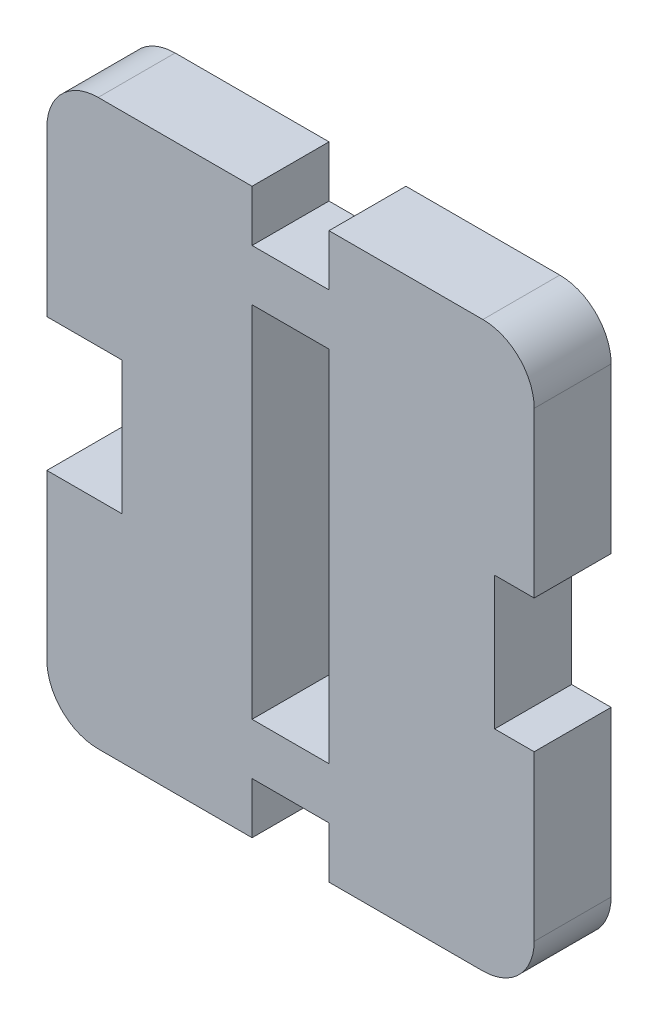
ISO-10303-21;
HEADER;
FILE_DESCRIPTION(('STEP AP214'),'2;1');
FILE_NAME('part.step','',(''),(''),'','','');
FILE_SCHEMA(('AUTOMOTIVE_DESIGN { 1 0 10303 214 1 1 1 1 }'));
ENDSEC;
DATA;
#1=APPLICATION_CONTEXT('core data for automotive mechanical design processes');
#2=APPLICATION_PROTOCOL_DEFINITION('international standard','automotive_design',2000,#1);
#3=PRODUCT_CONTEXT('',#1,'mechanical');
#4=PRODUCT('Part','Part','',(#3));
#5=PRODUCT_RELATED_PRODUCT_CATEGORY('part','',(#4));
#6=PRODUCT_DEFINITION_FORMATION('','',#4);
#7=PRODUCT_DEFINITION_CONTEXT('part definition',#1,'design');
#8=PRODUCT_DEFINITION('design','',#6,#7);
#9=PRODUCT_DEFINITION_SHAPE('','',#8);
#10=(LENGTH_UNIT() NAMED_UNIT(*) SI_UNIT(.MILLI.,.METRE.));
#11=(NAMED_UNIT(*) PLANE_ANGLE_UNIT() SI_UNIT($,.RADIAN.));
#12=(NAMED_UNIT(*) SI_UNIT($,.STERADIAN.) SOLID_ANGLE_UNIT());
#13=UNCERTAINTY_MEASURE_WITH_UNIT(LENGTH_MEASURE(1.E-05),#10,'distance_accuracy_value','');
#14=(GEOMETRIC_REPRESENTATION_CONTEXT(3) GLOBAL_UNCERTAINTY_ASSIGNED_CONTEXT((#13)) GLOBAL_UNIT_ASSIGNED_CONTEXT((#10,
#11,#12)) REPRESENTATION_CONTEXT('',''));
#15=CARTESIAN_POINT('',(0.,0.,0.));
#16=DIRECTION('',(0.,0.,1.));
#17=DIRECTION('',(1.,0.,0.));
#18=AXIS2_PLACEMENT_3D('',#15,#16,#17);
#19=CARTESIAN_POINT('',(-1050.11691061095,53.9977448376059,3.00000000000001));
#20=DIRECTION('',(0.,0.,-1.));
#21=DIRECTION('',(-1.,0.,0.));
#22=AXIS2_PLACEMENT_3D('',#19,#20,#21);
#23=PLANE('',#22);
#24=CARTESIAN_POINT('',(-1050.11691061095,53.9977448376059,3.00000000000001));
#25=DIRECTION('',(0.,0.,1.));
#26=DIRECTION('',(-1.,0.,0.));
#27=AXIS2_PLACEMENT_3D('',#24,#25,#26);
#28=CIRCLE('',#27,2.);
#29=CARTESIAN_POINT('',(-1050.11691061095,55.9977448376059,2.99999999999988));
#30=VERTEX_POINT('',#29);
#31=CARTESIAN_POINT('',(-1052.11691061095,53.9977448376059,3.00000000000005));
#32=VERTEX_POINT('',#31);
#33=EDGE_CURVE('E303',#30,#32,#28,.T.);
#34=ORIENTED_EDGE('',*,*,#33,.T.);
#35=DIRECTION('',(0.,-1.,0.));
#36=VECTOR('',#35,1.);
#37=CARTESIAN_POINT('',(-1052.11691061095,47.5930739118333,2.99999999999998));
#38=LINE('',#37,#36);
#39=CARTESIAN_POINT('',(-1052.11691061095,47.5930739118333,2.99999999999998));
#40=VERTEX_POINT('',#39);
#41=EDGE_CURVE('E306',#32,#40,#38,.T.);
#42=ORIENTED_EDGE('',*,*,#41,.T.);
#43=DIRECTION('',(1.,0.,0.));
#44=VECTOR('',#43,1.);
#45=CARTESIAN_POINT('',(-1049.19041833405,47.5930739118332,2.99999999999998));
#46=LINE('',#45,#44);
#47=CARTESIAN_POINT('',(-1049.19041833405,47.5930739118332,2.99999999999998));
#48=VERTEX_POINT('',#47);
#49=EDGE_CURVE('E308',#40,#48,#46,.T.);
#50=ORIENTED_EDGE('',*,*,#49,.T.);
#51=DIRECTION('',(0.,-1.,0.));
#52=VECTOR('',#51,1.);
#53=CARTESIAN_POINT('',(-1049.19041833405,42.4024157633785,2.99999999999991));
#54=LINE('',#53,#52);
#55=CARTESIAN_POINT('',(-1049.19041833405,42.4024157633785,2.99999999999991));
#56=VERTEX_POINT('',#55);
#57=EDGE_CURVE('E310',#48,#56,#54,.T.);
#58=ORIENTED_EDGE('',*,*,#57,.T.);
#59=DIRECTION('',(-1.,0.,0.));
#60=VECTOR('',#59,1.);
#61=CARTESIAN_POINT('',(-1049.19041833405,42.4024157633785,2.99999999999991));
#62=LINE('',#61,#60);
#63=CARTESIAN_POINT('',(-1052.11691061095,42.4024157633785,2.99999999999994));
#64=VERTEX_POINT('',#63);
#65=EDGE_CURVE('E312',#56,#64,#62,.T.);
#66=ORIENTED_EDGE('',*,*,#65,.T.);
#67=DIRECTION('',(0.,-1.,0.));
#68=VECTOR('',#67,1.);
#69=CARTESIAN_POINT('',(-1052.11691061095,42.4024157633785,2.99999999999994));
#70=LINE('',#69,#68);
#71=CARTESIAN_POINT('',(-1052.11691061095,35.9977448376059,3.00000000000002));
#72=VERTEX_POINT('',#71);
#73=EDGE_CURVE('E314',#64,#72,#70,.T.);
#74=ORIENTED_EDGE('',*,*,#73,.T.);
#75=CARTESIAN_POINT('',(-1050.11691061095,35.9977448376059,3.00000000000004));
#76=DIRECTION('',(0.,0.,1.));
#77=DIRECTION('',(1.,0.,0.));
#78=AXIS2_PLACEMENT_3D('',#75,#76,#77);
#79=CIRCLE('',#78,2.00000000000011);
#80=CARTESIAN_POINT('',(-1050.11691061095,33.9977448376059,3.00000000000002));
#81=VERTEX_POINT('',#80);
#82=EDGE_CURVE('E316',#72,#81,#79,.T.);
#83=ORIENTED_EDGE('',*,*,#82,.T.);
#84=DIRECTION('',(1.,0.,0.));
#85=VECTOR('',#84,1.);
#86=CARTESIAN_POINT('',(-1050.11691061095,33.9977448376059,2.99999999999998));
#87=LINE('',#86,#85);
#88=CARTESIAN_POINT('',(-1044.11691061095,33.9977448376059,3.));
#89=VERTEX_POINT('',#88);
#90=EDGE_CURVE('E318',#81,#89,#87,.T.);
#91=ORIENTED_EDGE('',*,*,#90,.T.);
#92=DIRECTION('',(0.,1.,0.));
#93=VECTOR('',#92,1.);
#94=CARTESIAN_POINT('',(-1044.11691061095,35.9977448376058,3.00000000000009));
#95=LINE('',#94,#93);
#96=CARTESIAN_POINT('',(-1044.11691061095,35.9977448376058,3.00000000000009));
#97=VERTEX_POINT('',#96);
#98=EDGE_CURVE('E320',#89,#97,#95,.T.);
#99=ORIENTED_EDGE('',*,*,#98,.T.);
#100=DIRECTION('',(1.,0.,0.));
#101=VECTOR('',#100,1.);
#102=CARTESIAN_POINT('',(-1042.61691061095,35.9977448376061,3.00000000000011));
#103=LINE('',#102,#101);
#104=CARTESIAN_POINT('',(-1041.11691061095,35.997744837606,3.00000000000002));
#105=VERTEX_POINT('',#104);
#106=EDGE_CURVE('E322',#97,#105,#103,.T.);
#107=ORIENTED_EDGE('',*,*,#106,.T.);
#108=DIRECTION('',(0.,-1.,0.));
#109=VECTOR('',#108,1.);
#110=CARTESIAN_POINT('',(-1041.11691061095,35.997744837606,3.00000000000002));
#111=LINE('',#110,#109);
#112=CARTESIAN_POINT('',(-1041.11691061095,33.9977448376059,3.00000000000002));
#113=VERTEX_POINT('',#112);
#114=EDGE_CURVE('E324',#105,#113,#111,.T.);
#115=ORIENTED_EDGE('',*,*,#114,.T.);
#116=DIRECTION('',(1.,0.,0.));
#117=VECTOR('',#116,1.);
#118=CARTESIAN_POINT('',(-1041.11691061095,33.9977448376059,3.00000000000002));
#119=LINE('',#118,#117);
#120=CARTESIAN_POINT('',(-1035.11691061095,33.9977448376059,3.00000000000002));
#121=VERTEX_POINT('',#120);
#122=EDGE_CURVE('E326',#113,#121,#119,.T.);
#123=ORIENTED_EDGE('',*,*,#122,.T.);
#124=CARTESIAN_POINT('',(-1035.11691061095,35.9977448376061,2.99999999999996));
#125=DIRECTION('',(0.,0.,1.));
#126=DIRECTION('',(-1.,0.,0.));
#127=AXIS2_PLACEMENT_3D('',#124,#125,#126);
#128=CIRCLE('',#127,2.);
#129=CARTESIAN_POINT('',(-1033.11691061095,35.9977448376058,3.0000000000001));
#130=VERTEX_POINT('',#129);
#131=EDGE_CURVE('E328',#121,#130,#128,.T.);
#132=ORIENTED_EDGE('',*,*,#131,.T.);
#133=DIRECTION('',(0.,1.,0.));
#134=VECTOR('',#133,1.);
#135=CARTESIAN_POINT('',(-1033.11691061095,35.9977448376058,3.0000000000001));
#136=LINE('',#135,#134);
#137=CARTESIAN_POINT('',(-1033.11691061095,42.4024157633785,2.99999999999998));
#138=VERTEX_POINT('',#137);
#139=EDGE_CURVE('E330',#130,#138,#136,.T.);
#140=ORIENTED_EDGE('',*,*,#139,.T.);
#141=DIRECTION('',(-1.,0.,0.));
#142=VECTOR('',#141,1.);
#143=CARTESIAN_POINT('',(-1033.11691061095,42.4024157633785,2.99999999999998));
#144=LINE('',#143,#142);
#145=CARTESIAN_POINT('',(-1034.65769352971,42.4024157633785,2.99999999999996));
#146=VERTEX_POINT('',#145);
#147=EDGE_CURVE('E332',#138,#146,#144,.T.);
#148=ORIENTED_EDGE('',*,*,#147,.T.);
#149=DIRECTION('',(0.,1.,0.));
#150=VECTOR('',#149,1.);
#151=CARTESIAN_POINT('',(-1034.65769352971,47.5930739118333,2.99999999999995));
#152=LINE('',#151,#150);
#153=CARTESIAN_POINT('',(-1034.65769352971,47.5930739118333,2.99999999999995));
#154=VERTEX_POINT('',#153);
#155=EDGE_CURVE('E334',#146,#154,#152,.T.);
#156=ORIENTED_EDGE('',*,*,#155,.T.);
#157=DIRECTION('',(1.,0.,0.));
#158=VECTOR('',#157,1.);
#159=CARTESIAN_POINT('',(-1033.11691061095,47.5930739118333,2.99999999999996));
#160=LINE('',#159,#158);
#161=CARTESIAN_POINT('',(-1033.11691061095,47.5930739118333,2.99999999999996));
#162=VERTEX_POINT('',#161);
#163=EDGE_CURVE('E336',#154,#162,#160,.T.);
#164=ORIENTED_EDGE('',*,*,#163,.T.);
#165=DIRECTION('',(0.,1.,0.));
#166=VECTOR('',#165,1.);
#167=CARTESIAN_POINT('',(-1033.11691061095,53.9977448376059,3.00000000000001));
#168=LINE('',#167,#166);
#169=CARTESIAN_POINT('',(-1033.11691061095,53.9977448376059,3.00000000000001));
#170=VERTEX_POINT('',#169);
#171=EDGE_CURVE('E338',#162,#170,#168,.T.);
#172=ORIENTED_EDGE('',*,*,#171,.T.);
#173=CARTESIAN_POINT('',(-1035.11691061095,53.9977448376059,3.00000000000004));
#174=DIRECTION('',(0.,0.,1.));
#175=DIRECTION('',(1.,0.,0.));
#176=AXIS2_PLACEMENT_3D('',#173,#174,#175);
#177=CIRCLE('',#176,2.);
#178=CARTESIAN_POINT('',(-1035.11691061095,55.9977448376059,2.99999999999983));
#179=VERTEX_POINT('',#178);
#180=EDGE_CURVE('E340',#170,#179,#177,.T.);
#181=ORIENTED_EDGE('',*,*,#180,.T.);
#182=DIRECTION('',(-1.,0.,0.));
#183=VECTOR('',#182,1.);
#184=CARTESIAN_POINT('',(-1041.11691061095,55.9977448376061,3.0000000000001));
#185=LINE('',#184,#183);
#186=CARTESIAN_POINT('',(-1041.11691061095,55.9977448376061,3.0000000000001));
#187=VERTEX_POINT('',#186);
#188=EDGE_CURVE('E342',#179,#187,#185,.T.);
#189=ORIENTED_EDGE('',*,*,#188,.T.);
#190=DIRECTION('',(0.,-1.,0.));
#191=VECTOR('',#190,1.);
#192=CARTESIAN_POINT('',(-1041.11691061095,53.9977448376059,3.00000000000009));
#193=LINE('',#192,#191);
#194=CARTESIAN_POINT('',(-1041.11691061095,53.9977448376059,3.00000000000009));
#195=VERTEX_POINT('',#194);
#196=EDGE_CURVE('E344',#187,#195,#193,.T.);
#197=ORIENTED_EDGE('',*,*,#196,.T.);
#198=DIRECTION('',(-1.,0.,0.));
#199=VECTOR('',#198,1.);
#200=CARTESIAN_POINT('',(-1042.61691061095,53.9977448376059,3.00000000000002));
#201=LINE('',#200,#199);
#202=CARTESIAN_POINT('',(-1044.11691061095,53.9977448376059,3.00000000000004));
#203=VERTEX_POINT('',#202);
#204=EDGE_CURVE('E346',#195,#203,#201,.T.);
#205=ORIENTED_EDGE('',*,*,#204,.T.);
#206=DIRECTION('',(0.,1.,0.));
#207=VECTOR('',#206,1.);
#208=CARTESIAN_POINT('',(-1044.11691061095,53.9977448376059,3.00000000000004));
#209=LINE('',#208,#207);
#210=CARTESIAN_POINT('',(-1044.11691061095,55.9977448376058,3.00000000000013));
#211=VERTEX_POINT('',#210);
#212=EDGE_CURVE('E348',#203,#211,#209,.T.);
#213=ORIENTED_EDGE('',*,*,#212,.T.);
#214=DIRECTION('',(-1.,0.,0.));
#215=VECTOR('',#214,1.);
#216=CARTESIAN_POINT('',(-1050.11691061095,55.9977448376059,2.99999999999988));
#217=LINE('',#216,#215);
#218=EDGE_CURVE('E350',#211,#30,#217,.T.);
#219=ORIENTED_EDGE('',*,*,#218,.T.);
#220=EDGE_LOOP('',(#34,#42,#50,#58,#66,#74,#83,#91,#99,#107,#115,#123,#132,#140,#148,#156,#164,
#172,#181,#189,#197,#205,#213,#219));
#221=FACE_BOUND('',#220,.T.);
#222=DIRECTION('',(-1.,0.,0.));
#223=VECTOR('',#222,1.);
#224=CARTESIAN_POINT('',(-1041.11691061095,51.997744837606,3.00000000000014));
#225=LINE('',#224,#223);
#226=CARTESIAN_POINT('',(-1041.11691061095,51.997744837606,3.00000000000014));
#227=VERTEX_POINT('',#226);
#228=CARTESIAN_POINT('',(-1044.11691061095,51.9977448376059,3.00000000000007));
#229=VERTEX_POINT('',#228);
#230=EDGE_CURVE('E232',#227,#229,#225,.T.);
#231=ORIENTED_EDGE('',*,*,#230,.F.);
#232=DIRECTION('',(0.,1.,0.));
#233=VECTOR('',#232,1.);
#234=CARTESIAN_POINT('',(-1041.11691061095,37.997744837606,3.00000000000002));
#235=LINE('',#234,#233);
#236=CARTESIAN_POINT('',(-1041.11691061095,37.997744837606,3.00000000000002));
#237=VERTEX_POINT('',#236);
#238=EDGE_CURVE('E247',#237,#227,#235,.T.);
#239=ORIENTED_EDGE('',*,*,#238,.F.);
#240=DIRECTION('',(1.,0.,0.));
#241=VECTOR('',#240,1.);
#242=CARTESIAN_POINT('',(-1041.11691061095,37.997744837606,3.00000000000002));
#243=LINE('',#242,#241);
#244=CARTESIAN_POINT('',(-1044.11691061095,37.9977448376059,2.99999999999999));
#245=VERTEX_POINT('',#244);
#246=EDGE_CURVE('E245',#245,#237,#243,.T.);
#247=ORIENTED_EDGE('',*,*,#246,.F.);
#248=DIRECTION('',(0.,-1.,0.));
#249=VECTOR('',#248,1.);
#250=CARTESIAN_POINT('',(-1044.11691061095,51.9977448376059,3.00000000000007));
#251=LINE('',#250,#249);
#252=EDGE_CURVE('E243',#229,#245,#251,.T.);
#253=ORIENTED_EDGE('',*,*,#252,.F.);
#254=EDGE_LOOP('',(#231,#239,#247,#253));
#255=FACE_BOUND('',#254,.T.);
#256=ADVANCED_FACE('F32',(#221,#255),#23,.F.);
#257=CARTESIAN_POINT('',(-1050.11691061095,53.9977448376059,0.));
#258=DIRECTION('',(0.,0.,-1.));
#259=DIRECTION('',(-1.,0.,0.));
#260=AXIS2_PLACEMENT_3D('',#257,#258,#259);
#261=PLANE('',#260);
#262=CARTESIAN_POINT('',(-1050.11691061095,53.9977448376059,0.));
#263=DIRECTION('',(0.,0.,1.));
#264=DIRECTION('',(-1.,0.,0.));
#265=AXIS2_PLACEMENT_3D('',#262,#263,#264);
#266=CIRCLE('',#265,2.);
#267=CARTESIAN_POINT('',(-1050.11691061095,55.9977448376059,-1.2490009027033E-13));
#268=VERTEX_POINT('',#267);
#269=CARTESIAN_POINT('',(-1052.11691061095,53.9977448376058,0.));
#270=VERTEX_POINT('',#269);
#271=EDGE_CURVE('E233',#268,#270,#266,.T.);
#272=ORIENTED_EDGE('',*,*,#271,.F.);
#273=DIRECTION('',(-1.,0.,0.));
#274=VECTOR('',#273,1.);
#275=CARTESIAN_POINT('',(-1050.11691061095,55.9977448376059,-1.2490009027033E-13));
#276=LINE('',#275,#274);
#277=CARTESIAN_POINT('',(-1044.11691061095,55.9977448376059,0.));
#278=VERTEX_POINT('',#277);
#279=EDGE_CURVE('E301',#278,#268,#276,.T.);
#280=ORIENTED_EDGE('',*,*,#279,.F.);
#281=DIRECTION('',(0.,1.,0.));
#282=VECTOR('',#281,1.);
#283=CARTESIAN_POINT('',(-1044.11691061095,53.9977448376058,0.));
#284=LINE('',#283,#282);
#285=CARTESIAN_POINT('',(-1044.11691061095,53.9977448376058,0.));
#286=VERTEX_POINT('',#285);
#287=EDGE_CURVE('E299',#286,#278,#284,.T.);
#288=ORIENTED_EDGE('',*,*,#287,.F.);
#289=DIRECTION('',(-1.,0.,0.));
#290=VECTOR('',#289,1.);
#291=CARTESIAN_POINT('',(-1042.61691061095,53.997744837606,0.));
#292=LINE('',#291,#290);
#293=CARTESIAN_POINT('',(-1041.11691061095,53.9977448376061,0.));
#294=VERTEX_POINT('',#293);
#295=EDGE_CURVE('E297',#294,#286,#292,.T.);
#296=ORIENTED_EDGE('',*,*,#295,.F.);
#297=DIRECTION('',(0.,-1.,0.));
#298=VECTOR('',#297,1.);
#299=CARTESIAN_POINT('',(-1041.11691061095,53.9977448376061,0.));
#300=LINE('',#299,#298);
#301=CARTESIAN_POINT('',(-1041.11691061095,55.9977448376061,1.45716771982052E-13));
#302=VERTEX_POINT('',#301);
#303=EDGE_CURVE('E294',#302,#294,#300,.T.);
#304=ORIENTED_EDGE('',*,*,#303,.F.);
#305=DIRECTION('',(-1.,0.,0.));
#306=VECTOR('',#305,1.);
#307=CARTESIAN_POINT('',(-1041.11691061095,55.9977448376061,1.45716771982052E-13));
#308=LINE('',#307,#306);
#309=CARTESIAN_POINT('',(-1035.11691061095,55.9977448376059,0.));
#310=VERTEX_POINT('',#309);
#311=EDGE_CURVE('E292',#310,#302,#308,.T.);
#312=ORIENTED_EDGE('',*,*,#311,.F.);
#313=CARTESIAN_POINT('',(-1035.11691061095,53.997744837606,0.));
#314=DIRECTION('',(0.,0.,1.));
#315=DIRECTION('',(1.,0.,0.));
#316=AXIS2_PLACEMENT_3D('',#313,#314,#315);
#317=CIRCLE('',#316,2.);
#318=CARTESIAN_POINT('',(-1033.11691061095,53.9977448376058,0.));
#319=VERTEX_POINT('',#318);
#320=EDGE_CURVE('E290',#319,#310,#317,.T.);
#321=ORIENTED_EDGE('',*,*,#320,.F.);
#322=DIRECTION('',(0.,1.,0.));
#323=VECTOR('',#322,1.);
#324=CARTESIAN_POINT('',(-1033.11691061095,53.9977448376058,0.));
#325=LINE('',#324,#323);
#326=CARTESIAN_POINT('',(-1033.11691061095,47.5930739118333,0.));
#327=VERTEX_POINT('',#326);
#328=EDGE_CURVE('E288',#327,#319,#325,.T.);
#329=ORIENTED_EDGE('',*,*,#328,.F.);
#330=DIRECTION('',(1.,0.,0.));
#331=VECTOR('',#330,1.);
#332=CARTESIAN_POINT('',(-1033.11691061095,47.5930739118333,0.));
#333=LINE('',#332,#331);
#334=CARTESIAN_POINT('',(-1034.65769352971,47.5930739118334,-1.31838984174237E-13));
#335=VERTEX_POINT('',#334);
#336=EDGE_CURVE('E286',#335,#327,#333,.T.);
#337=ORIENTED_EDGE('',*,*,#336,.F.);
#338=DIRECTION('',(0.,1.,0.));
#339=VECTOR('',#338,1.);
#340=CARTESIAN_POINT('',(-1034.65769352971,47.5930739118334,-1.31838984174237E-13));
#341=LINE('',#340,#339);
#342=CARTESIAN_POINT('',(-1034.65769352971,42.4024157633785,0.));
#343=VERTEX_POINT('',#342);
#344=EDGE_CURVE('E284',#343,#335,#341,.T.);
#345=ORIENTED_EDGE('',*,*,#344,.F.);
#346=DIRECTION('',(-1.,0.,0.));
#347=VECTOR('',#346,1.);
#348=CARTESIAN_POINT('',(-1033.11691061095,42.4024157633785,0.));
#349=LINE('',#348,#347);
#350=CARTESIAN_POINT('',(-1033.11691061095,42.4024157633785,0.));
#351=VERTEX_POINT('',#350);
#352=EDGE_CURVE('E282',#351,#343,#349,.T.);
#353=ORIENTED_EDGE('',*,*,#352,.F.);
#354=DIRECTION('',(0.,1.,0.));
#355=VECTOR('',#354,1.);
#356=CARTESIAN_POINT('',(-1033.11691061095,35.9977448376059,1.38777878078145E-13));
#357=LINE('',#356,#355);
#358=CARTESIAN_POINT('',(-1033.11691061095,35.9977448376059,1.38777878078145E-13));
#359=VERTEX_POINT('',#358);
#360=EDGE_CURVE('E280',#359,#351,#357,.T.);
#361=ORIENTED_EDGE('',*,*,#360,.F.);
#362=CARTESIAN_POINT('',(-1035.11691061095,35.9977448376059,0.));
#363=DIRECTION('',(0.,0.,1.));
#364=DIRECTION('',(-1.,0.,0.));
#365=AXIS2_PLACEMENT_3D('',#362,#363,#364);
#366=CIRCLE('',#365,2.);
#367=CARTESIAN_POINT('',(-1035.11691061095,33.9977448376059,0.));
#368=VERTEX_POINT('',#367);
#369=EDGE_CURVE('E278',#368,#359,#366,.T.);
#370=ORIENTED_EDGE('',*,*,#369,.F.);
#371=DIRECTION('',(1.,0.,0.));
#372=VECTOR('',#371,1.);
#373=CARTESIAN_POINT('',(-1041.11691061095,33.997744837606,0.));
#374=LINE('',#373,#372);
#375=CARTESIAN_POINT('',(-1041.11691061095,33.997744837606,0.));
#376=VERTEX_POINT('',#375);
#377=EDGE_CURVE('E276',#376,#368,#374,.T.);
#378=ORIENTED_EDGE('',*,*,#377,.F.);
#379=DIRECTION('',(0.,-1.,0.));
#380=VECTOR('',#379,1.);
#381=CARTESIAN_POINT('',(-1041.11691061095,35.9977448376061,0.));
#382=LINE('',#381,#380);
#383=CARTESIAN_POINT('',(-1041.11691061095,35.9977448376061,0.));
#384=VERTEX_POINT('',#383);
#385=EDGE_CURVE('E274',#384,#376,#382,.T.);
#386=ORIENTED_EDGE('',*,*,#385,.F.);
#387=DIRECTION('',(1.,0.,0.));
#388=VECTOR('',#387,1.);
#389=CARTESIAN_POINT('',(-1042.61691061095,35.9977448376062,1.04083408558608E-13));
#390=LINE('',#389,#388);
#391=CARTESIAN_POINT('',(-1044.11691061095,35.9977448376058,1.31838984174237E-13));
#392=VERTEX_POINT('',#391);
#393=EDGE_CURVE('E272',#392,#384,#390,.T.);
#394=ORIENTED_EDGE('',*,*,#393,.F.);
#395=DIRECTION('',(0.,1.,0.));
#396=VECTOR('',#395,1.);
#397=CARTESIAN_POINT('',(-1044.11691061095,35.9977448376058,1.31838984174237E-13));
#398=LINE('',#397,#396);
#399=CARTESIAN_POINT('',(-1044.11691061095,33.9977448376058,0.));
#400=VERTEX_POINT('',#399);
#401=EDGE_CURVE('E269',#400,#392,#398,.T.);
#402=ORIENTED_EDGE('',*,*,#401,.F.);
#403=DIRECTION('',(1.,0.,0.));
#404=VECTOR('',#403,1.);
#405=CARTESIAN_POINT('',(-1050.11691061095,33.9977448376059,0.));
#406=LINE('',#405,#404);
#407=CARTESIAN_POINT('',(-1050.11691061095,33.9977448376059,0.));
#408=VERTEX_POINT('',#407);
#409=EDGE_CURVE('E267',#408,#400,#406,.T.);
#410=ORIENTED_EDGE('',*,*,#409,.F.);
#411=CARTESIAN_POINT('',(-1050.11691061095,35.9977448376059,0.));
#412=DIRECTION('',(0.,0.,1.));
#413=DIRECTION('',(1.,0.,0.));
#414=AXIS2_PLACEMENT_3D('',#411,#412,#413);
#415=CIRCLE('',#414,2.00000000000011);
#416=CARTESIAN_POINT('',(-1052.11691061095,35.9977448376058,0.));
#417=VERTEX_POINT('',#416);
#418=EDGE_CURVE('E265',#417,#408,#415,.T.);
#419=ORIENTED_EDGE('',*,*,#418,.F.);
#420=DIRECTION('',(0.,-1.,0.));
#421=VECTOR('',#420,1.);
#422=CARTESIAN_POINT('',(-1052.11691061095,42.4024157633785,0.));
#423=LINE('',#422,#421);
#424=CARTESIAN_POINT('',(-1052.11691061095,42.4024157633785,0.));
#425=VERTEX_POINT('',#424);
#426=EDGE_CURVE('E263',#425,#417,#423,.T.);
#427=ORIENTED_EDGE('',*,*,#426,.F.);
#428=DIRECTION('',(-1.,0.,0.));
#429=VECTOR('',#428,1.);
#430=CARTESIAN_POINT('',(-1049.19041833405,42.4024157633785,0.));
#431=LINE('',#430,#429);
#432=CARTESIAN_POINT('',(-1049.19041833405,42.4024157633785,0.));
#433=VERTEX_POINT('',#432);
#434=EDGE_CURVE('E261',#433,#425,#431,.T.);
#435=ORIENTED_EDGE('',*,*,#434,.F.);
#436=DIRECTION('',(0.,-1.,0.));
#437=VECTOR('',#436,1.);
#438=CARTESIAN_POINT('',(-1049.19041833405,42.4024157633785,0.));
#439=LINE('',#438,#437);
#440=CARTESIAN_POINT('',(-1049.19041833405,47.5930739118333,0.));
#441=VERTEX_POINT('',#440);
#442=EDGE_CURVE('E259',#441,#433,#439,.T.);
#443=ORIENTED_EDGE('',*,*,#442,.F.);
#444=DIRECTION('',(1.,0.,0.));
#445=VECTOR('',#444,1.);
#446=CARTESIAN_POINT('',(-1049.19041833405,47.5930739118333,0.));
#447=LINE('',#446,#445);
#448=CARTESIAN_POINT('',(-1052.11691061095,47.5930739118333,0.));
#449=VERTEX_POINT('',#448);
#450=EDGE_CURVE('E257',#449,#441,#447,.T.);
#451=ORIENTED_EDGE('',*,*,#450,.F.);
#452=DIRECTION('',(0.,-1.,0.));
#453=VECTOR('',#452,1.);
#454=CARTESIAN_POINT('',(-1052.11691061095,47.5930739118333,0.));
#455=LINE('',#454,#453);
#456=EDGE_CURVE('E255',#270,#449,#455,.T.);
#457=ORIENTED_EDGE('',*,*,#456,.F.);
#458=EDGE_LOOP('',(#272,#280,#288,#296,#304,#312,#321,#329,#337,#345,#353,#361,#370,#378,#386,
#394,#402,#410,#419,#427,#435,#443,#451,#457));
#459=FACE_BOUND('',#458,.T.);
#460=DIRECTION('',(0.,1.,0.));
#461=VECTOR('',#460,1.);
#462=CARTESIAN_POINT('',(-1041.11691061095,37.997744837606,0.));
#463=LINE('',#462,#461);
#464=CARTESIAN_POINT('',(-1041.11691061095,37.997744837606,0.));
#465=VERTEX_POINT('',#464);
#466=CARTESIAN_POINT('',(-1041.11691061095,51.997744837606,0.));
#467=VERTEX_POINT('',#466);
#468=EDGE_CURVE('E237',#465,#467,#463,.T.);
#469=ORIENTED_EDGE('',*,*,#468,.T.);
#470=DIRECTION('',(-1.,0.,0.));
#471=VECTOR('',#470,1.);
#472=CARTESIAN_POINT('',(-1041.11691061095,51.997744837606,0.));
#473=LINE('',#472,#471);
#474=CARTESIAN_POINT('',(-1044.11691061095,51.9977448376058,0.));
#475=VERTEX_POINT('',#474);
#476=EDGE_CURVE('E55',#467,#475,#473,.T.);
#477=ORIENTED_EDGE('',*,*,#476,.T.);
#478=DIRECTION('',(0.,-1.,0.));
#479=VECTOR('',#478,1.);
#480=CARTESIAN_POINT('',(-1044.11691061095,51.9977448376058,0.));
#481=LINE('',#480,#479);
#482=CARTESIAN_POINT('',(-1044.11691061095,37.9977448376059,0.));
#483=VERTEX_POINT('',#482);
#484=EDGE_CURVE('E219',#475,#483,#481,.T.);
#485=ORIENTED_EDGE('',*,*,#484,.T.);
#486=DIRECTION('',(1.,0.,0.));
#487=VECTOR('',#486,1.);
#488=CARTESIAN_POINT('',(-1041.11691061095,37.997744837606,0.));
#489=LINE('',#488,#487);
#490=EDGE_CURVE('E228',#483,#465,#489,.T.);
#491=ORIENTED_EDGE('',*,*,#490,.T.);
#492=EDGE_LOOP('',(#469,#477,#485,#491));
#493=FACE_BOUND('',#492,.T.);
#494=ADVANCED_FACE('F236',(#459,#493),#261,.T.);
#495=CARTESIAN_POINT('',(-1050.11691061095,53.9977448376059,3.00000000000001));
#496=DIRECTION('',(0.,0.,-1.));
#497=DIRECTION('',(-1.,0.,0.));
#498=AXIS2_PLACEMENT_3D('',#495,#496,#497);
#499=CYLINDRICAL_SURFACE('',#498,2.);
#500=ORIENTED_EDGE('',*,*,#271,.T.);
#501=DIRECTION('',(0.,0.,-1.));
#502=VECTOR('',#501,1.);
#503=CARTESIAN_POINT('',(-1052.11691061095,53.9977448376059,3.00000000000005));
#504=LINE('',#503,#502);
#505=EDGE_CURVE('E11',#32,#270,#504,.T.);
#506=ORIENTED_EDGE('',*,*,#505,.F.);
#507=ORIENTED_EDGE('',*,*,#33,.F.);
#508=DIRECTION('',(0.,0.,-1.));
#509=VECTOR('',#508,1.);
#510=CARTESIAN_POINT('',(-1050.11691061095,55.9977448376059,2.99999999999988));
#511=LINE('',#510,#509);
#512=EDGE_CURVE('E352',#30,#268,#511,.T.);
#513=ORIENTED_EDGE('',*,*,#512,.T.);
#514=EDGE_LOOP('',(#500,#506,#507,#513));
#515=FACE_BOUND('',#514,.T.);
#516=ADVANCED_FACE('F34',(#515),#499,.T.);
#517=CARTESIAN_POINT('',(-1052.11691061095,47.5930739118333,2.99999999999998));
#518=DIRECTION('',(1.,0.,0.));
#519=DIRECTION('',(0.,1.,0.));
#520=AXIS2_PLACEMENT_3D('',#517,#518,#519);
#521=PLANE('',#520);
#522=ORIENTED_EDGE('',*,*,#456,.T.);
#523=DIRECTION('',(0.,0.,-1.));
#524=VECTOR('',#523,1.);
#525=CARTESIAN_POINT('',(-1052.11691061095,47.5930739118333,2.99999999999998));
#526=LINE('',#525,#524);
#527=EDGE_CURVE('E40',#40,#449,#526,.T.);
#528=ORIENTED_EDGE('',*,*,#527,.F.);
#529=ORIENTED_EDGE('',*,*,#41,.F.);
#530=ORIENTED_EDGE('',*,*,#505,.T.);
#531=EDGE_LOOP('',(#522,#528,#529,#530));
#532=FACE_BOUND('',#531,.T.);
#533=ADVANCED_FACE('F444',(#532),#521,.F.);
#534=CARTESIAN_POINT('',(-1049.19041833405,47.5930739118332,2.99999999999998));
#535=DIRECTION('',(0.,1.,0.));
#536=DIRECTION('',(0.,0.,1.));
#537=AXIS2_PLACEMENT_3D('',#534,#535,#536);
#538=PLANE('',#537);
#539=ORIENTED_EDGE('',*,*,#450,.T.);
#540=DIRECTION('',(0.,0.,-1.));
#541=VECTOR('',#540,1.);
#542=CARTESIAN_POINT('',(-1049.19041833405,47.5930739118332,2.99999999999998));
#543=LINE('',#542,#541);
#544=EDGE_CURVE('E415',#48,#441,#543,.T.);
#545=ORIENTED_EDGE('',*,*,#544,.F.);
#546=ORIENTED_EDGE('',*,*,#49,.F.);
#547=ORIENTED_EDGE('',*,*,#527,.T.);
#548=EDGE_LOOP('',(#539,#545,#546,#547));
#549=FACE_BOUND('',#548,.T.);
#550=ADVANCED_FACE('F422',(#549),#538,.F.);
#551=CARTESIAN_POINT('',(-1049.19041833405,42.4024157633785,2.99999999999991));
#552=DIRECTION('',(1.,0.,0.));
#553=DIRECTION('',(0.,0.,-1.));
#554=AXIS2_PLACEMENT_3D('',#551,#552,#553);
#555=PLANE('',#554);
#556=ORIENTED_EDGE('',*,*,#442,.T.);
#557=DIRECTION('',(0.,0.,-1.));
#558=VECTOR('',#557,1.);
#559=CARTESIAN_POINT('',(-1049.19041833405,42.4024157633785,2.99999999999991));
#560=LINE('',#559,#558);
#561=EDGE_CURVE('E412',#56,#433,#560,.T.);
#562=ORIENTED_EDGE('',*,*,#561,.F.);
#563=ORIENTED_EDGE('',*,*,#57,.F.);
#564=ORIENTED_EDGE('',*,*,#544,.T.);
#565=EDGE_LOOP('',(#556,#562,#563,#564));
#566=FACE_BOUND('',#565,.T.);
#567=ADVANCED_FACE('F432',(#566),#555,.F.);
#568=CARTESIAN_POINT('',(-1049.19041833405,42.4024157633785,2.99999999999991));
#569=DIRECTION('',(0.,-1.,0.));
#570=DIRECTION('',(0.,0.,-1.));
#571=AXIS2_PLACEMENT_3D('',#568,#569,#570);
#572=PLANE('',#571);
#573=ORIENTED_EDGE('',*,*,#434,.T.);
#574=DIRECTION('',(0.,0.,-1.));
#575=VECTOR('',#574,1.);
#576=CARTESIAN_POINT('',(-1052.11691061095,42.4024157633785,2.99999999999994));
#577=LINE('',#576,#575);
#578=EDGE_CURVE('E409',#64,#425,#577,.T.);
#579=ORIENTED_EDGE('',*,*,#578,.F.);
#580=ORIENTED_EDGE('',*,*,#65,.F.);
#581=ORIENTED_EDGE('',*,*,#561,.T.);
#582=EDGE_LOOP('',(#573,#579,#580,#581));
#583=FACE_BOUND('',#582,.T.);
#584=ADVANCED_FACE('F436',(#583),#572,.F.);
#585=CARTESIAN_POINT('',(-1052.11691061095,42.4024157633785,2.99999999999994));
#586=DIRECTION('',(1.,0.,0.));
#587=DIRECTION('',(0.,1.,0.));
#588=AXIS2_PLACEMENT_3D('',#585,#586,#587);
#589=PLANE('',#588);
#590=ORIENTED_EDGE('',*,*,#426,.T.);
#591=DIRECTION('',(0.,0.,-1.));
#592=VECTOR('',#591,1.);
#593=CARTESIAN_POINT('',(-1052.11691061095,35.9977448376059,3.00000000000002));
#594=LINE('',#593,#592);
#595=EDGE_CURVE('E406',#72,#417,#594,.T.);
#596=ORIENTED_EDGE('',*,*,#595,.F.);
#597=ORIENTED_EDGE('',*,*,#73,.F.);
#598=ORIENTED_EDGE('',*,*,#578,.T.);
#599=EDGE_LOOP('',(#590,#596,#597,#598));
#600=FACE_BOUND('',#599,.T.);
#601=ADVANCED_FACE('F535',(#600),#589,.F.);
#602=CARTESIAN_POINT('',(-1050.11691061095,35.9977448376059,3.00000000000004));
#603=DIRECTION('',(0.,0.,-1.));
#604=DIRECTION('',(-1.,0.,0.));
#605=AXIS2_PLACEMENT_3D('',#602,#603,#604);
#606=CYLINDRICAL_SURFACE('',#605,2.00000000000011);
#607=ORIENTED_EDGE('',*,*,#418,.T.);
#608=DIRECTION('',(0.,0.,-1.));
#609=VECTOR('',#608,1.);
#610=CARTESIAN_POINT('',(-1050.11691061095,33.9977448376059,3.00000000000002));
#611=LINE('',#610,#609);
#612=EDGE_CURVE('E403',#81,#408,#611,.T.);
#613=ORIENTED_EDGE('',*,*,#612,.F.);
#614=ORIENTED_EDGE('',*,*,#82,.F.);
#615=ORIENTED_EDGE('',*,*,#595,.T.);
#616=EDGE_LOOP('',(#607,#613,#614,#615));
#617=FACE_BOUND('',#616,.T.);
#618=ADVANCED_FACE('F533',(#617),#606,.T.);
#619=CARTESIAN_POINT('',(-1050.11691061095,33.9977448376059,2.99999999999998));
#620=DIRECTION('',(0.,1.,0.));
#621=DIRECTION('',(-1.,0.,0.));
#622=AXIS2_PLACEMENT_3D('',#619,#620,#621);
#623=PLANE('',#622);
#624=ORIENTED_EDGE('',*,*,#409,.T.);
#625=DIRECTION('',(0.,0.,-1.));
#626=VECTOR('',#625,1.);
#627=CARTESIAN_POINT('',(-1044.11691061095,33.9977448376059,3.));
#628=LINE('',#627,#626);
#629=EDGE_CURVE('E400',#89,#400,#628,.T.);
#630=ORIENTED_EDGE('',*,*,#629,.F.);
#631=ORIENTED_EDGE('',*,*,#90,.F.);
#632=ORIENTED_EDGE('',*,*,#612,.T.);
#633=EDGE_LOOP('',(#624,#630,#631,#632));
#634=FACE_BOUND('',#633,.T.);
#635=ADVANCED_FACE('F530',(#634),#623,.F.);
#636=CARTESIAN_POINT('',(-1044.11691061095,35.9977448376058,3.00000000000009));
#637=DIRECTION('',(-1.,0.,0.));
#638=DIRECTION('',(0.,0.,1.));
#639=AXIS2_PLACEMENT_3D('',#636,#637,#638);
#640=PLANE('',#639);
#641=ORIENTED_EDGE('',*,*,#401,.T.);
#642=DIRECTION('',(0.,0.,-1.));
#643=VECTOR('',#642,1.);
#644=CARTESIAN_POINT('',(-1044.11691061095,35.9977448376058,3.00000000000009));
#645=LINE('',#644,#643);
#646=EDGE_CURVE('E397',#97,#392,#645,.T.);
#647=ORIENTED_EDGE('',*,*,#646,.F.);
#648=ORIENTED_EDGE('',*,*,#98,.F.);
#649=ORIENTED_EDGE('',*,*,#629,.T.);
#650=EDGE_LOOP('',(#641,#647,#648,#649));
#651=FACE_BOUND('',#650,.T.);
#652=ADVANCED_FACE('F521',(#651),#640,.F.);
#653=CARTESIAN_POINT('',(-1042.61691061095,35.9977448376061,3.00000000000011));
#654=DIRECTION('',(0.,1.,0.));
#655=DIRECTION('',(0.,0.,1.));
#656=AXIS2_PLACEMENT_3D('',#653,#654,#655);
#657=PLANE('',#656);
#658=ORIENTED_EDGE('',*,*,#393,.T.);
#659=DIRECTION('',(0.,0.,-1.));
#660=VECTOR('',#659,1.);
#661=CARTESIAN_POINT('',(-1041.11691061095,35.997744837606,3.00000000000002));
#662=LINE('',#661,#660);
#663=EDGE_CURVE('E394',#105,#384,#662,.T.);
#664=ORIENTED_EDGE('',*,*,#663,.F.);
#665=ORIENTED_EDGE('',*,*,#106,.F.);
#666=ORIENTED_EDGE('',*,*,#646,.T.);
#667=EDGE_LOOP('',(#658,#664,#665,#666));
#668=FACE_BOUND('',#667,.T.);
#669=ADVANCED_FACE('F525',(#668),#657,.F.);
#670=CARTESIAN_POINT('',(-1041.11691061095,35.997744837606,3.00000000000002));
#671=DIRECTION('',(1.,0.,0.));
#672=DIRECTION('',(0.,0.,-1.));
#673=AXIS2_PLACEMENT_3D('',#670,#671,#672);
#674=PLANE('',#673);
#675=ORIENTED_EDGE('',*,*,#385,.T.);
#676=DIRECTION('',(0.,0.,-1.));
#677=VECTOR('',#676,1.);
#678=CARTESIAN_POINT('',(-1041.11691061095,33.9977448376059,3.00000000000002));
#679=LINE('',#678,#677);
#680=EDGE_CURVE('E391',#113,#376,#679,.T.);
#681=ORIENTED_EDGE('',*,*,#680,.F.);
#682=ORIENTED_EDGE('',*,*,#114,.F.);
#683=ORIENTED_EDGE('',*,*,#663,.T.);
#684=EDGE_LOOP('',(#675,#681,#682,#683));
#685=FACE_BOUND('',#684,.T.);
#686=ADVANCED_FACE('F514',(#685),#674,.F.);
#687=CARTESIAN_POINT('',(-1041.11691061095,33.9977448376059,3.00000000000002));
#688=DIRECTION('',(0.,1.,0.));
#689=DIRECTION('',(-1.,0.,0.));
#690=AXIS2_PLACEMENT_3D('',#687,#688,#689);
#691=PLANE('',#690);
#692=ORIENTED_EDGE('',*,*,#377,.T.);
#693=DIRECTION('',(0.,0.,-1.));
#694=VECTOR('',#693,1.);
#695=CARTESIAN_POINT('',(-1035.11691061095,33.9977448376059,3.00000000000002));
#696=LINE('',#695,#694);
#697=EDGE_CURVE('E388',#121,#368,#696,.T.);
#698=ORIENTED_EDGE('',*,*,#697,.F.);
#699=ORIENTED_EDGE('',*,*,#122,.F.);
#700=ORIENTED_EDGE('',*,*,#680,.T.);
#701=EDGE_LOOP('',(#692,#698,#699,#700));
#702=FACE_BOUND('',#701,.T.);
#703=ADVANCED_FACE('F510',(#702),#691,.F.);
#704=CARTESIAN_POINT('',(-1035.11691061095,35.9977448376061,2.99999999999996));
#705=DIRECTION('',(0.,0.,-1.));
#706=DIRECTION('',(-1.,0.,0.));
#707=AXIS2_PLACEMENT_3D('',#704,#705,#706);
#708=CYLINDRICAL_SURFACE('',#707,2.);
#709=ORIENTED_EDGE('',*,*,#369,.T.);
#710=DIRECTION('',(0.,0.,-1.));
#711=VECTOR('',#710,1.);
#712=CARTESIAN_POINT('',(-1033.11691061095,35.9977448376058,3.0000000000001));
#713=LINE('',#712,#711);
#714=EDGE_CURVE('E385',#130,#359,#713,.T.);
#715=ORIENTED_EDGE('',*,*,#714,.F.);
#716=ORIENTED_EDGE('',*,*,#131,.F.);
#717=ORIENTED_EDGE('',*,*,#697,.T.);
#718=EDGE_LOOP('',(#709,#715,#716,#717));
#719=FACE_BOUND('',#718,.T.);
#720=ADVANCED_FACE('F505',(#719),#708,.T.);
#721=CARTESIAN_POINT('',(-1033.11691061095,35.9977448376058,3.0000000000001));
#722=DIRECTION('',(-1.,0.,0.));
#723=DIRECTION('',(0.,0.,1.));
#724=AXIS2_PLACEMENT_3D('',#721,#722,#723);
#725=PLANE('',#724);
#726=ORIENTED_EDGE('',*,*,#360,.T.);
#727=DIRECTION('',(0.,0.,-1.));
#728=VECTOR('',#727,1.);
#729=CARTESIAN_POINT('',(-1033.11691061095,42.4024157633785,2.99999999999998));
#730=LINE('',#729,#728);
#731=EDGE_CURVE('E382',#138,#351,#730,.T.);
#732=ORIENTED_EDGE('',*,*,#731,.F.);
#733=ORIENTED_EDGE('',*,*,#139,.F.);
#734=ORIENTED_EDGE('',*,*,#714,.T.);
#735=EDGE_LOOP('',(#726,#732,#733,#734));
#736=FACE_BOUND('',#735,.T.);
#737=ADVANCED_FACE('F499',(#736),#725,.F.);
#738=CARTESIAN_POINT('',(-1033.11691061095,42.4024157633785,2.99999999999998));
#739=DIRECTION('',(0.,-1.,0.));
#740=DIRECTION('',(0.,0.,-1.));
#741=AXIS2_PLACEMENT_3D('',#738,#739,#740);
#742=PLANE('',#741);
#743=ORIENTED_EDGE('',*,*,#352,.T.);
#744=DIRECTION('',(0.,0.,-1.));
#745=VECTOR('',#744,1.);
#746=CARTESIAN_POINT('',(-1034.65769352971,42.4024157633785,2.99999999999996));
#747=LINE('',#746,#745);
#748=EDGE_CURVE('E379',#146,#343,#747,.T.);
#749=ORIENTED_EDGE('',*,*,#748,.F.);
#750=ORIENTED_EDGE('',*,*,#147,.F.);
#751=ORIENTED_EDGE('',*,*,#731,.T.);
#752=EDGE_LOOP('',(#743,#749,#750,#751));
#753=FACE_BOUND('',#752,.T.);
#754=ADVANCED_FACE('F495',(#753),#742,.F.);
#755=CARTESIAN_POINT('',(-1034.65769352971,47.5930739118333,2.99999999999995));
#756=DIRECTION('',(-1.,0.,0.));
#757=DIRECTION('',(0.,0.,1.));
#758=AXIS2_PLACEMENT_3D('',#755,#756,#757);
#759=PLANE('',#758);
#760=ORIENTED_EDGE('',*,*,#344,.T.);
#761=DIRECTION('',(0.,0.,-1.));
#762=VECTOR('',#761,1.);
#763=CARTESIAN_POINT('',(-1034.65769352971,47.5930739118333,2.99999999999995));
#764=LINE('',#763,#762);
#765=EDGE_CURVE('E376',#154,#335,#764,.T.);
#766=ORIENTED_EDGE('',*,*,#765,.F.);
#767=ORIENTED_EDGE('',*,*,#155,.F.);
#768=ORIENTED_EDGE('',*,*,#748,.T.);
#769=EDGE_LOOP('',(#760,#766,#767,#768));
#770=FACE_BOUND('',#769,.T.);
#771=ADVANCED_FACE('F490',(#770),#759,.F.);
#772=CARTESIAN_POINT('',(-1033.11691061095,47.5930739118333,2.99999999999996));
#773=DIRECTION('',(0.,1.,0.));
#774=DIRECTION('',(0.,0.,1.));
#775=AXIS2_PLACEMENT_3D('',#772,#773,#774);
#776=PLANE('',#775);
#777=ORIENTED_EDGE('',*,*,#336,.T.);
#778=DIRECTION('',(0.,0.,-1.));
#779=VECTOR('',#778,1.);
#780=CARTESIAN_POINT('',(-1033.11691061095,47.5930739118333,2.99999999999996));
#781=LINE('',#780,#779);
#782=EDGE_CURVE('E373',#162,#327,#781,.T.);
#783=ORIENTED_EDGE('',*,*,#782,.F.);
#784=ORIENTED_EDGE('',*,*,#163,.F.);
#785=ORIENTED_EDGE('',*,*,#765,.T.);
#786=EDGE_LOOP('',(#777,#783,#784,#785));
#787=FACE_BOUND('',#786,.T.);
#788=ADVANCED_FACE('F484',(#787),#776,.F.);
#789=CARTESIAN_POINT('',(-1033.11691061095,53.9977448376059,3.00000000000001));
#790=DIRECTION('',(-1.,0.,0.));
#791=DIRECTION('',(0.,0.,1.));
#792=AXIS2_PLACEMENT_3D('',#789,#790,#791);
#793=PLANE('',#792);
#794=ORIENTED_EDGE('',*,*,#328,.T.);
#795=DIRECTION('',(0.,0.,-1.));
#796=VECTOR('',#795,1.);
#797=CARTESIAN_POINT('',(-1033.11691061095,53.9977448376059,3.00000000000001));
#798=LINE('',#797,#796);
#799=EDGE_CURVE('E370',#170,#319,#798,.T.);
#800=ORIENTED_EDGE('',*,*,#799,.F.);
#801=ORIENTED_EDGE('',*,*,#171,.F.);
#802=ORIENTED_EDGE('',*,*,#782,.T.);
#803=EDGE_LOOP('',(#794,#800,#801,#802));
#804=FACE_BOUND('',#803,.T.);
#805=ADVANCED_FACE('F480',(#804),#793,.F.);
#806=CARTESIAN_POINT('',(-1035.11691061095,53.9977448376059,3.00000000000004));
#807=DIRECTION('',(0.,0.,-1.));
#808=DIRECTION('',(-1.,0.,0.));
#809=AXIS2_PLACEMENT_3D('',#806,#807,#808);
#810=CYLINDRICAL_SURFACE('',#809,2.);
#811=ORIENTED_EDGE('',*,*,#320,.T.);
#812=DIRECTION('',(0.,0.,-1.));
#813=VECTOR('',#812,1.);
#814=CARTESIAN_POINT('',(-1035.11691061095,55.9977448376059,2.99999999999983));
#815=LINE('',#814,#813);
#816=EDGE_CURVE('E367',#179,#310,#815,.T.);
#817=ORIENTED_EDGE('',*,*,#816,.F.);
#818=ORIENTED_EDGE('',*,*,#180,.F.);
#819=ORIENTED_EDGE('',*,*,#799,.T.);
#820=EDGE_LOOP('',(#811,#817,#818,#819));
#821=FACE_BOUND('',#820,.T.);
#822=ADVANCED_FACE('F475',(#821),#810,.T.);
#823=CARTESIAN_POINT('',(-1041.11691061095,55.9977448376061,3.0000000000001));
#824=DIRECTION('',(0.,-1.,0.));
#825=DIRECTION('',(0.,0.,-1.));
#826=AXIS2_PLACEMENT_3D('',#823,#824,#825);
#827=PLANE('',#826);
#828=ORIENTED_EDGE('',*,*,#311,.T.);
#829=DIRECTION('',(0.,0.,-1.));
#830=VECTOR('',#829,1.);
#831=CARTESIAN_POINT('',(-1041.11691061095,55.9977448376061,3.0000000000001));
#832=LINE('',#831,#830);
#833=EDGE_CURVE('E364',#187,#302,#832,.T.);
#834=ORIENTED_EDGE('',*,*,#833,.F.);
#835=ORIENTED_EDGE('',*,*,#188,.F.);
#836=ORIENTED_EDGE('',*,*,#816,.T.);
#837=EDGE_LOOP('',(#828,#834,#835,#836));
#838=FACE_BOUND('',#837,.T.);
#839=ADVANCED_FACE('F469',(#838),#827,.F.);
#840=CARTESIAN_POINT('',(-1041.11691061095,53.9977448376059,3.00000000000009));
#841=DIRECTION('',(1.,0.,0.));
#842=DIRECTION('',(0.,0.,-1.));
#843=AXIS2_PLACEMENT_3D('',#840,#841,#842);
#844=PLANE('',#843);
#845=ORIENTED_EDGE('',*,*,#303,.T.);
#846=DIRECTION('',(0.,0.,-1.));
#847=VECTOR('',#846,1.);
#848=CARTESIAN_POINT('',(-1041.11691061095,53.9977448376059,3.00000000000009));
#849=LINE('',#848,#847);
#850=EDGE_CURVE('E361',#195,#294,#849,.T.);
#851=ORIENTED_EDGE('',*,*,#850,.F.);
#852=ORIENTED_EDGE('',*,*,#196,.F.);
#853=ORIENTED_EDGE('',*,*,#833,.T.);
#854=EDGE_LOOP('',(#845,#851,#852,#853));
#855=FACE_BOUND('',#854,.T.);
#856=ADVANCED_FACE('F464',(#855),#844,.F.);
#857=CARTESIAN_POINT('',(-1042.61691061095,53.9977448376059,3.00000000000002));
#858=DIRECTION('',(0.,-1.,0.));
#859=DIRECTION('',(1.,0.,0.));
#860=AXIS2_PLACEMENT_3D('',#857,#858,#859);
#861=PLANE('',#860);
#862=ORIENTED_EDGE('',*,*,#295,.T.);
#863=DIRECTION('',(0.,0.,-1.));
#864=VECTOR('',#863,1.);
#865=CARTESIAN_POINT('',(-1044.11691061095,53.9977448376059,3.00000000000004));
#866=LINE('',#865,#864);
#867=EDGE_CURVE('E358',#203,#286,#866,.T.);
#868=ORIENTED_EDGE('',*,*,#867,.F.);
#869=ORIENTED_EDGE('',*,*,#204,.F.);
#870=ORIENTED_EDGE('',*,*,#850,.T.);
#871=EDGE_LOOP('',(#862,#868,#869,#870));
#872=FACE_BOUND('',#871,.T.);
#873=ADVANCED_FACE('F459',(#872),#861,.F.);
#874=CARTESIAN_POINT('',(-1044.11691061095,53.9977448376059,3.00000000000004));
#875=DIRECTION('',(-1.,0.,0.));
#876=DIRECTION('',(0.,0.,1.));
#877=AXIS2_PLACEMENT_3D('',#874,#875,#876);
#878=PLANE('',#877);
#879=ORIENTED_EDGE('',*,*,#287,.T.);
#880=DIRECTION('',(0.,0.,-1.));
#881=VECTOR('',#880,1.);
#882=CARTESIAN_POINT('',(-1044.11691061095,55.9977448376058,3.00000000000013));
#883=LINE('',#882,#881);
#884=EDGE_CURVE('E355',#211,#278,#883,.T.);
#885=ORIENTED_EDGE('',*,*,#884,.F.);
#886=ORIENTED_EDGE('',*,*,#212,.F.);
#887=ORIENTED_EDGE('',*,*,#867,.T.);
#888=EDGE_LOOP('',(#879,#885,#886,#887));
#889=FACE_BOUND('',#888,.T.);
#890=ADVANCED_FACE('F455',(#889),#878,.F.);
#891=CARTESIAN_POINT('',(-1050.11691061095,55.9977448376059,2.99999999999988));
#892=DIRECTION('',(0.,-1.,0.));
#893=DIRECTION('',(0.,0.,-1.));
#894=AXIS2_PLACEMENT_3D('',#891,#892,#893);
#895=PLANE('',#894);
#896=ORIENTED_EDGE('',*,*,#279,.T.);
#897=ORIENTED_EDGE('',*,*,#512,.F.);
#898=ORIENTED_EDGE('',*,*,#218,.F.);
#899=ORIENTED_EDGE('',*,*,#884,.T.);
#900=EDGE_LOOP('',(#896,#897,#898,#899));
#901=FACE_BOUND('',#900,.T.);
#902=ADVANCED_FACE('F450',(#901),#895,.F.);
#903=CARTESIAN_POINT('',(-1041.11691061095,51.997744837606,3.00000000000014));
#904=DIRECTION('',(0.,-1.,0.));
#905=DIRECTION('',(0.,0.,-1.));
#906=AXIS2_PLACEMENT_3D('',#903,#904,#905);
#907=PLANE('',#906);
#908=ORIENTED_EDGE('',*,*,#476,.F.);
#909=DIRECTION('',(0.,0.,-1.));
#910=VECTOR('',#909,1.);
#911=CARTESIAN_POINT('',(-1041.11691061095,51.997744837606,3.00000000000014));
#912=LINE('',#911,#910);
#913=EDGE_CURVE('E249',#227,#467,#912,.T.);
#914=ORIENTED_EDGE('',*,*,#913,.F.);
#915=ORIENTED_EDGE('',*,*,#230,.T.);
#916=DIRECTION('',(0.,0.,-1.));
#917=VECTOR('',#916,1.);
#918=CARTESIAN_POINT('',(-1044.11691061095,51.9977448376059,3.00000000000007));
#919=LINE('',#918,#917);
#920=EDGE_CURVE('E221',#229,#475,#919,.T.);
#921=ORIENTED_EDGE('',*,*,#920,.T.);
#922=EDGE_LOOP('',(#908,#914,#915,#921));
#923=FACE_BOUND('',#922,.T.);
#924=ADVANCED_FACE('F230',(#923),#907,.T.);
#925=CARTESIAN_POINT('',(-1044.11691061095,51.9977448376059,3.00000000000007));
#926=DIRECTION('',(1.,0.,0.));
#927=DIRECTION('',(0.,0.,-1.));
#928=AXIS2_PLACEMENT_3D('',#925,#926,#927);
#929=PLANE('',#928);
#930=ORIENTED_EDGE('',*,*,#484,.F.);
#931=ORIENTED_EDGE('',*,*,#920,.F.);
#932=ORIENTED_EDGE('',*,*,#252,.T.);
#933=DIRECTION('',(0.,0.,-1.));
#934=VECTOR('',#933,1.);
#935=CARTESIAN_POINT('',(-1044.11691061095,37.9977448376059,2.99999999999999));
#936=LINE('',#935,#934);
#937=EDGE_CURVE('E224',#245,#483,#936,.T.);
#938=ORIENTED_EDGE('',*,*,#937,.T.);
#939=EDGE_LOOP('',(#930,#931,#932,#938));
#940=FACE_BOUND('',#939,.T.);
#941=ADVANCED_FACE('F220',(#940),#929,.T.);
#942=CARTESIAN_POINT('',(-1041.11691061095,37.997744837606,3.00000000000002));
#943=DIRECTION('',(0.,1.,0.));
#944=DIRECTION('',(0.,0.,1.));
#945=AXIS2_PLACEMENT_3D('',#942,#943,#944);
#946=PLANE('',#945);
#947=ORIENTED_EDGE('',*,*,#490,.F.);
#948=ORIENTED_EDGE('',*,*,#937,.F.);
#949=ORIENTED_EDGE('',*,*,#246,.T.);
#950=DIRECTION('',(0.,0.,-1.));
#951=VECTOR('',#950,1.);
#952=CARTESIAN_POINT('',(-1041.11691061095,37.997744837606,3.00000000000002));
#953=LINE('',#952,#951);
#954=EDGE_CURVE('E47',#237,#465,#953,.T.);
#955=ORIENTED_EDGE('',*,*,#954,.T.);
#956=EDGE_LOOP('',(#947,#948,#949,#955));
#957=FACE_BOUND('',#956,.T.);
#958=ADVANCED_FACE('F664',(#957),#946,.T.);
#959=CARTESIAN_POINT('',(-1041.11691061095,37.997744837606,3.00000000000002));
#960=DIRECTION('',(-1.,0.,0.));
#961=DIRECTION('',(0.,0.,1.));
#962=AXIS2_PLACEMENT_3D('',#959,#960,#961);
#963=PLANE('',#962);
#964=ORIENTED_EDGE('',*,*,#468,.F.);
#965=ORIENTED_EDGE('',*,*,#954,.F.);
#966=ORIENTED_EDGE('',*,*,#238,.T.);
#967=ORIENTED_EDGE('',*,*,#913,.T.);
#968=EDGE_LOOP('',(#964,#965,#966,#967));
#969=FACE_BOUND('',#968,.T.);
#970=ADVANCED_FACE('F671',(#969),#963,.T.);
#971=CLOSED_SHELL('',(#256,#494,#516,#533,#550,#567,#584,#601,#618,#635,#652,#669,#686,#703,
#720,#737,#754,#771,#788,#805,#822,#839,#856,#873,#890,#902,#924,#941,#958,#970));
#972=MANIFOLD_SOLID_BREP('B2',#971);
#973=ADVANCED_BREP_SHAPE_REPRESENTATION('',(#18,#972),#14);
#974=SHAPE_DEFINITION_REPRESENTATION(#9,#973);
ENDSEC;
END-ISO-10303-21;
